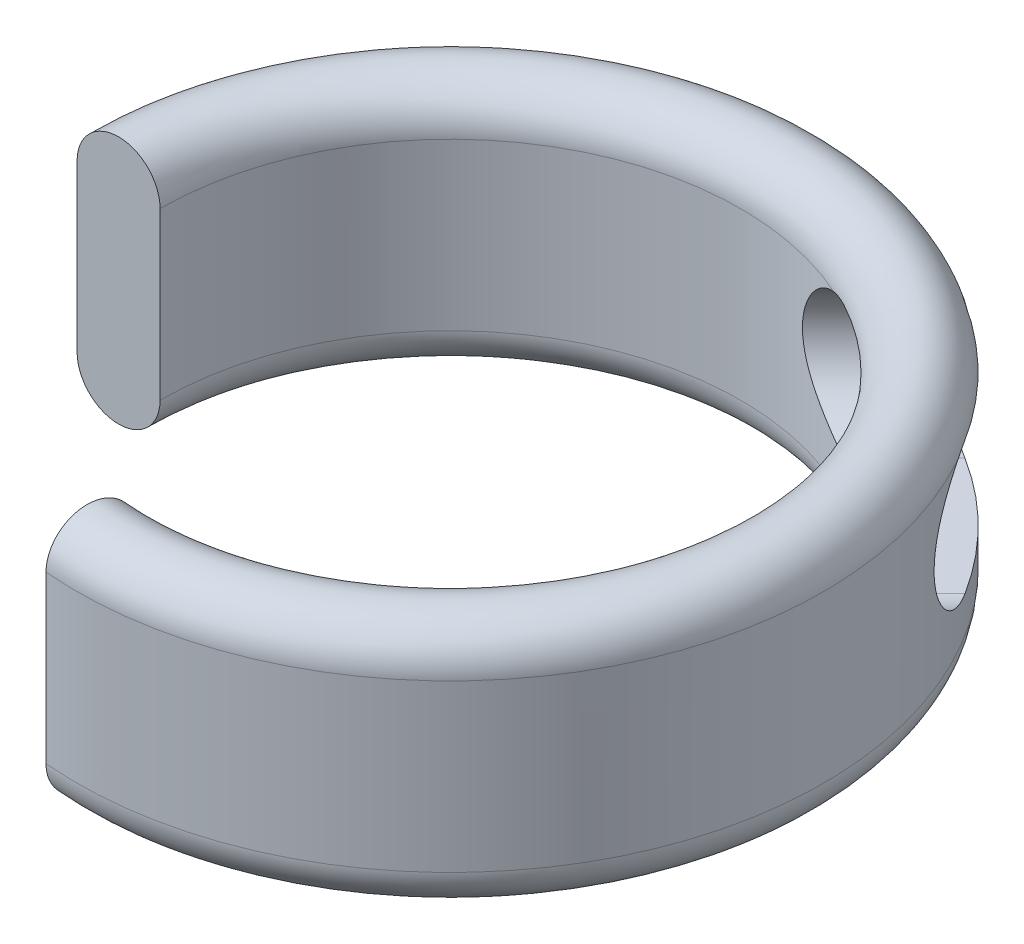
ISO-10303-21;
HEADER;
FILE_DESCRIPTION(('STEP AP214'),'2;1');
FILE_NAME('part.step','',(''),(''),'','','');
FILE_SCHEMA(('AUTOMOTIVE_DESIGN { 1 0 10303 214 1 1 1 1 }'));
ENDSEC;
DATA;
#1=APPLICATION_CONTEXT('core data for automotive mechanical design processes');
#2=APPLICATION_PROTOCOL_DEFINITION('international standard','automotive_design',2000,#1);
#3=PRODUCT_CONTEXT('',#1,'mechanical');
#4=PRODUCT('Part','Part','',(#3));
#5=PRODUCT_RELATED_PRODUCT_CATEGORY('part','',(#4));
#6=PRODUCT_DEFINITION_FORMATION('','',#4);
#7=PRODUCT_DEFINITION_CONTEXT('part definition',#1,'design');
#8=PRODUCT_DEFINITION('design','',#6,#7);
#9=PRODUCT_DEFINITION_SHAPE('','',#8);
#10=(LENGTH_UNIT() NAMED_UNIT(*) SI_UNIT(.MILLI.,.METRE.));
#11=(NAMED_UNIT(*) PLANE_ANGLE_UNIT() SI_UNIT($,.RADIAN.));
#12=(NAMED_UNIT(*) SI_UNIT($,.STERADIAN.) SOLID_ANGLE_UNIT());
#13=UNCERTAINTY_MEASURE_WITH_UNIT(LENGTH_MEASURE(1.E-05),#10,'distance_accuracy_value','');
#14=(GEOMETRIC_REPRESENTATION_CONTEXT(3) GLOBAL_UNCERTAINTY_ASSIGNED_CONTEXT((#13)) GLOBAL_UNIT_ASSIGNED_CONTEXT((#10,
#11,#12)) REPRESENTATION_CONTEXT('',''));
#15=CARTESIAN_POINT('',(0.,0.,0.));
#16=DIRECTION('',(0.,0.,1.));
#17=DIRECTION('',(1.,0.,0.));
#18=AXIS2_PLACEMENT_3D('',#15,#16,#17);
#19=CARTESIAN_POINT('',(0.,-5.,0.));
#20=DIRECTION('',(0.,1.,0.));
#21=DIRECTION('',(0.,0.,1.));
#22=AXIS2_PLACEMENT_3D('',#19,#20,#21);
#23=TOROIDAL_SURFACE('',#22,20.,2.5);
#24=CARTESIAN_POINT('',(0.,-5.,0.));
#25=DIRECTION('',(0.,1.,0.));
#26=DIRECTION('',(0.,0.,1.));
#27=AXIS2_PLACEMENT_3D('',#24,#25,#26);
#28=CIRCLE('',#27,22.5);
#29=CARTESIAN_POINT('',(-1.96100421182254,-5.,22.4143807070643));
#30=VERTEX_POINT('',#29);
#31=CARTESIAN_POINT('',(-22.5,-5.,0.));
#32=VERTEX_POINT('',#31);
#33=EDGE_CURVE('E11',#30,#32,#28,.T.);
#34=ORIENTED_EDGE('',*,*,#33,.F.);
#35=CARTESIAN_POINT('',(-1.74311485495337,-5.,19.9238939618349));
#36=DIRECTION('',(0.996194698091745,0.,0.0871557427476685));
#37=DIRECTION('',(-0.0871557427476685,0.,0.996194698091745));
#38=AXIS2_PLACEMENT_3D('',#35,#36,#37);
#39=CIRCLE('',#38,2.5);
#40=CARTESIAN_POINT('',(-1.5252254980842,-5.,17.4334072166055));
#41=VERTEX_POINT('',#40);
#42=EDGE_CURVE('E215',#30,#41,#39,.T.);
#43=ORIENTED_EDGE('',*,*,#42,.T.);
#44=CARTESIAN_POINT('',(0.,-5.,0.));
#45=DIRECTION('',(0.,1.,0.));
#46=DIRECTION('',(0.,0.,1.));
#47=AXIS2_PLACEMENT_3D('',#44,#45,#46);
#48=CIRCLE('',#47,17.5);
#49=CARTESIAN_POINT('',(-17.5,-5.,0.));
#50=VERTEX_POINT('',#49);
#51=EDGE_CURVE('E138',#41,#50,#48,.T.);
#52=ORIENTED_EDGE('',*,*,#51,.T.);
#53=CARTESIAN_POINT('',(-20.,-5.,0.));
#54=DIRECTION('',(0.,0.,1.));
#55=DIRECTION('',(-1.,0.,0.));
#56=AXIS2_PLACEMENT_3D('',#53,#54,#55);
#57=CIRCLE('',#56,2.5);
#58=EDGE_CURVE('E203',#32,#50,#57,.T.);
#59=ORIENTED_EDGE('',*,*,#58,.F.);
#60=EDGE_LOOP('',(#34,#43,#52,#59));
#61=FACE_BOUND('',#60,.T.);
#62=ADVANCED_FACE('F32',(#61),#23,.T.);
#63=CARTESIAN_POINT('',(0.,8.7572648493363,0.));
#64=DIRECTION('',(0.,1.,0.));
#65=DIRECTION('',(0.,0.,1.));
#66=AXIS2_PLACEMENT_3D('',#63,#64,#65);
#67=CYLINDRICAL_SURFACE('',#66,22.5);
#68=CARTESIAN_POINT('',(19.0476259634213,-2.8166247903554,-11.9765581515559));
#69=CARTESIAN_POINT('',(19.1112808053138,-2.81663449361547,-11.8753381699285));
#70=CARTESIAN_POINT('',(19.1741050305086,-2.81152815478291,-11.7736144214588));
#71=CARTESIAN_POINT('',(19.297682841254,-2.79127634790485,-11.5699401065588));
#72=CARTESIAN_POINT('',(19.3584369161131,-2.77613326973139,-11.4679895998807));
#73=CARTESIAN_POINT('',(19.4774145068211,-2.73602813007706,-11.264732283442));
#74=CARTESIAN_POINT('',(19.5356413610721,-2.71107948883057,-11.1634247853956));
#75=CARTESIAN_POINT('',(19.6493222130538,-2.65163687784826,-10.9620950886562));
#76=CARTESIAN_POINT('',(19.7047760861263,-2.6171424794418,-10.8620729478959));
#77=CARTESIAN_POINT('',(19.8665093303682,-2.49978108803662,-10.5651485168745));
#78=CARTESIAN_POINT('',(19.968321191861,-2.40298081208176,-10.3711120389751));
#79=CARTESIAN_POINT('',(20.1581863217661,-2.17499931889684,-9.9970836324132));
#80=CARTESIAN_POINT('',(20.2462353670804,-2.04380758163209,-9.81709602307188));
#81=CARTESIAN_POINT('',(20.4089429514052,-1.74765982415584,-9.47426176627114));
#82=CARTESIAN_POINT('',(20.4833557117861,-1.58218085057608,-9.31174817005757));
#83=CARTESIAN_POINT('',(20.6161802014917,-1.22273550761816,-9.01386635430676));
#84=CARTESIAN_POINT('',(20.6745938918045,-1.02877263396019,-8.87849480854468));
#85=CARTESIAN_POINT('',(20.7731686956879,-0.624157616190643,-8.64528875041556));
#86=CARTESIAN_POINT('',(20.8138703146728,-0.414271100391892,-8.54635939385617));
#87=CARTESIAN_POINT('',(20.8792716108319,0.0214934989329085,-8.38532440449548));
#88=CARTESIAN_POINT('',(20.9039820128574,0.247360751623616,-8.32319409400337));
#89=CARTESIAN_POINT('',(20.9358150229594,0.690037043875171,-8.24277693584569));
#90=CARTESIAN_POINT('',(20.9441373109644,0.906219372918398,-8.22150258719835));
#91=CARTESIAN_POINT('',(20.9467511887985,1.33919593798512,-8.21484313469196));
#92=CARTESIAN_POINT('',(20.9410465562612,1.55598999355592,-8.22944836798995));
#93=CARTESIAN_POINT('',(20.9162697882783,1.97376503390804,-8.29220640011654));
#94=CARTESIAN_POINT('',(20.8978122711671,2.1750181889659,-8.33881614324561));
#95=CARTESIAN_POINT('',(20.8484045490777,2.56664641368433,-8.46158210491395));
#96=CARTESIAN_POINT('',(20.8174532838341,2.75702055854643,-8.53774083106727));
#97=CARTESIAN_POINT('',(20.7422113163949,3.128108903658,-8.71897625365073));
#98=CARTESIAN_POINT('',(20.6975381777496,3.30834321461,-8.82487337537717));
#99=CARTESIAN_POINT('',(20.5955957857789,3.64879258580033,-9.06023460400831));
#100=CARTESIAN_POINT('',(20.5383198768687,3.80899699778187,-9.18971115707608));
#101=CARTESIAN_POINT('',(20.4069050133556,4.11735694782195,-9.47814045174223));
#102=CARTESIAN_POINT('',(20.3318288989547,4.26373101526314,-9.63856902279767));
#103=CARTESIAN_POINT('',(20.1683663996515,4.52666005018138,-9.97607298224266));
#104=CARTESIAN_POINT('',(20.0799894542929,4.64323600818003,-10.1531365316367));
#105=CARTESIAN_POINT('',(19.9370967454699,4.79506687011639,-10.4294465738721));
#106=CARTESIAN_POINT('',(19.8870456657814,4.84228012763503,-10.5246053991375));
#107=CARTESIAN_POINT('',(19.7840091679533,4.9278230829872,-10.717037859409));
#108=CARTESIAN_POINT('',(19.7310293052555,4.96616892987277,-10.8143072914232));
#109=CARTESIAN_POINT('',(19.6766210125622,5.,-10.9124051211452));
#110=B_SPLINE_CURVE_WITH_KNOTS('',3,(#68,#69,#70,#71,#72,#73,#74,#75,#76,#77,#78,#79,#80,#81,
#82,#83,#84,#85,#86,#87,#88,#89,#90,#91,#92,#93,#94,#95,#96,#97,#98,#99,#100,#101,#102,#103,
#104,#105,#106,#107,#108,#109),.UNSPECIFIED.,.F.,.F.,(4,2,2,2,2,2,2,2,2,2,2,2,2,2,2,2,2,2,2,2,
4),(0.,0.358577940603546,0.717070530014299,1.07507417307113,1.43309389558167,2.1481723915515,
2.86346987927385,3.59060768548323,4.31765632731182,5.02062228439924,5.7231162924089,
6.37192927553386,7.02056754395255,7.63994565352756,8.25937633686054,8.89793661002136,
9.53683492284234,10.2232360246076,10.9091522676969,11.2610955173085,11.6123926804328),.UNSPECIFIED.);
#111=CARTESIAN_POINT('',(19.0476259634213,-2.8166247903554,-11.9765581515559));
#112=VERTEX_POINT('',#111);
#113=CARTESIAN_POINT('',(19.6766210125622,5.,-10.9124051211452));
#114=VERTEX_POINT('',#113);
#115=EDGE_CURVE('E153',#112,#114,#110,.T.);
#116=ORIENTED_EDGE('',*,*,#115,.T.);
#117=CARTESIAN_POINT('',(0.,5.,0.));
#118=DIRECTION('',(0.,1.,0.));
#119=DIRECTION('',(0.,0.,1.));
#120=AXIS2_PLACEMENT_3D('',#117,#118,#119);
#121=CIRCLE('',#120,22.5);
#122=CARTESIAN_POINT('',(-1.96100421182254,5.,22.4143807070643));
#123=VERTEX_POINT('',#122);
#124=EDGE_CURVE('E40',#123,#114,#121,.T.);
#125=ORIENTED_EDGE('',*,*,#124,.F.);
#126=DIRECTION('',(0.,-1.,0.));
#127=VECTOR('',#126,1.);
#128=CARTESIAN_POINT('',(-1.96100421182254,-5.,22.4143807070643));
#129=LINE('',#128,#127);
#130=EDGE_CURVE('E150',#123,#30,#129,.T.);
#131=ORIENTED_EDGE('',*,*,#130,.T.);
#132=ORIENTED_EDGE('',*,*,#33,.T.);
#133=DIRECTION('',(0.,-1.,0.));
#134=VECTOR('',#133,1.);
#135=CARTESIAN_POINT('',(-22.5,-5.,0.));
#136=LINE('',#135,#134);
#137=CARTESIAN_POINT('',(-22.5,5.,0.));
#138=VERTEX_POINT('',#137);
#139=EDGE_CURVE('E212',#138,#32,#136,.T.);
#140=ORIENTED_EDGE('',*,*,#139,.F.);
#141=CARTESIAN_POINT('',(10.9124051211451,5.,-19.6766210125622));
#142=VERTEX_POINT('',#141);
#143=EDGE_CURVE('E135',#142,#138,#121,.T.);
#144=ORIENTED_EDGE('',*,*,#143,.F.);
#145=CARTESIAN_POINT('',(10.9124051211451,5.,-19.6766210125622));
#146=CARTESIAN_POINT('',(10.8112788281494,4.96512293138315,-19.7327091287715));
#147=CARTESIAN_POINT('',(10.7110368970832,4.92545176740616,-19.7872768739975));
#148=CARTESIAN_POINT('',(10.5130067197237,4.83679949846682,-19.8931965676737));
#149=CARTESIAN_POINT('',(10.4152183651133,4.78781880530992,-19.9445486582343));
#150=CARTESIAN_POINT('',(10.1265306489725,4.62731502369787,-20.0935349252607));
#151=CARTESIAN_POINT('',(9.94032676599695,4.50223650081431,-20.1860891135028));
#152=CARTESIAN_POINT('',(9.58702931231416,4.21918863447551,-20.3562636147612));
#153=CARTESIAN_POINT('',(9.41994584658621,4.06120202261671,-20.4338760458331));
#154=CARTESIAN_POINT('',(9.11130123835496,3.71604725212527,-20.5733535789451));
#155=CARTESIAN_POINT('',(8.96972744060927,3.52889364953636,-20.6352264956028));
#156=CARTESIAN_POINT('',(8.72131813638106,3.13450187876605,-20.7414204468196));
#157=CARTESIAN_POINT('',(8.61377116209005,2.92781189625576,-20.7861058710407));
#158=CARTESIAN_POINT('',(8.43485117880354,2.49664771282691,-20.8593557806688));
#159=CARTESIAN_POINT('',(8.36346053602341,2.27218224307078,-20.8879281253501));
#160=CARTESIAN_POINT('',(8.26503848791453,1.82992343093873,-20.9270576474749));
#161=CARTESIAN_POINT('',(8.23509478891029,1.61288184834657,-20.9387999078415));
#162=CARTESIAN_POINT('',(8.21166598011529,1.17657518141999,-20.9480006405783));
#163=CARTESIAN_POINT('',(8.21816699750388,0.95731097485699,-20.9454645480564));
#164=CARTESIAN_POINT('',(8.26590462313557,0.534956068188104,-20.9266668880979));
#165=CARTESIAN_POINT('',(8.3053006401598,0.331620423230983,-20.9111325245937));
#166=CARTESIAN_POINT('',(8.41438361679444,-0.0653126174180232,-20.8674763372946));
#167=CARTESIAN_POINT('',(8.48407359011812,-0.258909042091143,-20.8393532611369));
#168=CARTESIAN_POINT('',(8.65242381674988,-0.63591395894377,-20.7700261943319));
#169=CARTESIAN_POINT('',(8.75170508329119,-0.818991942490817,-20.7285400793718));
#170=CARTESIAN_POINT('',(8.9744848564938,-1.16613576259315,-20.6330627694758));
#171=CARTESIAN_POINT('',(9.09798988419134,-1.33019646073264,-20.5790682065553));
#172=CARTESIAN_POINT('',(9.37454574032848,-1.64721752299958,-20.4546439317997));
#173=CARTESIAN_POINT('',(9.529084617285,-1.79852521330336,-20.3833100597849));
#174=CARTESIAN_POINT('',(9.85584214033346,-2.07262606372593,-20.2273365072675));
#175=CARTESIAN_POINT('',(10.0280709970524,-2.19540262083193,-20.1426891270853));
#176=CARTESIAN_POINT('',(10.395533694243,-2.41605322380842,-19.955646341974));
#177=CARTESIAN_POINT('',(10.5915253449574,-2.51202997684149,-19.8524983312321));
#178=CARTESIAN_POINT('',(10.9912606509598,-2.66610397759726,-19.63399745109));
#179=CARTESIAN_POINT('',(11.1949943924244,-2.72424804824495,-19.5186598742858));
#180=CARTESIAN_POINT('',(11.4957286423853,-2.7804152242195,-19.3419443848111));
#181=CARTESIAN_POINT('',(11.5922193582356,-2.79397174795233,-19.28427210612));
#182=CARTESIAN_POINT('',(11.7847946998896,-2.81206865563484,-19.1671935838323));
#183=CARTESIAN_POINT('',(11.880879716478,-2.81662243819806,-19.1077900507484));
#184=CARTESIAN_POINT('',(11.9765581515558,-2.8166247903554,-19.0476259634213));
#185=B_SPLINE_CURVE_WITH_KNOTS('',3,(#145,#146,#147,#148,#149,#150,#151,#152,#153,#154,#155,
#156,#157,#158,#159,#160,#161,#162,#163,#164,#165,#166,#167,#168,#169,#170,#171,#172,#173,#174,
#175,#176,#177,#178,#179,#180,#181,#182,#183,#184),.UNSPECIFIED.,.F.,.F.,(4,2,2,2,2,2,2,2,2,2,2,
2,2,2,2,2,2,2,2,4),(0.,0.362123295781596,0.724230576827122,1.44850920142525,2.17316885048552,
2.89746800306819,3.60543140045362,4.31304918409477,4.96787039060632,5.6224423538509,
6.24266676737018,6.8629528963829,7.49730265855499,8.13182342263911,8.81208373100889,
9.49273891484585,10.2135641496263,10.9334955627957,11.2728572298151,11.6117134497699),.UNSPECIFIED.);
#186=CARTESIAN_POINT('',(11.9765581515558,-2.8166247903554,-19.0476259634213));
#187=VERTEX_POINT('',#186);
#188=EDGE_CURVE('E47',#142,#187,#185,.T.);
#189=ORIENTED_EDGE('',*,*,#188,.T.);
#190=CARTESIAN_POINT('',(0.,-2.8166247903554,0.));
#191=DIRECTION('',(0.,-1.,0.));
#192=DIRECTION('',(1.,0.,0.));
#193=AXIS2_PLACEMENT_3D('',#190,#191,#192);
#194=CIRCLE('',#193,22.5);
#195=EDGE_CURVE('E154',#187,#112,#194,.T.);
#196=ORIENTED_EDGE('',*,*,#195,.T.);
#197=EDGE_LOOP('',(#116,#125,#131,#132,#140,#144,#189,#196));
#198=FACE_BOUND('',#197,.T.);
#199=ADVANCED_FACE('F34',(#198),#67,.T.);
#200=CARTESIAN_POINT('',(0.,5.,0.));
#201=DIRECTION('',(0.,1.,0.));
#202=DIRECTION('',(0.,0.,1.));
#203=AXIS2_PLACEMENT_3D('',#200,#201,#202);
#204=TOROIDAL_SURFACE('',#203,20.,2.5);
#205=CARTESIAN_POINT('',(14.0971750419305,4.32686626947927,-10.5242392906768));
#206=CARTESIAN_POINT('',(14.1331057788877,4.39009652917659,-10.4466072124374));
#207=CARTESIAN_POINT('',(14.1728266712285,4.45059223396145,-10.3685704791871));
#208=CARTESIAN_POINT('',(14.2582509340677,4.56541151959514,-10.2112267848131));
#209=CARTESIAN_POINT('',(14.3039544864483,4.61973491270219,-10.1319197851355));
#210=CARTESIAN_POINT('',(14.3993861205135,4.72112256629241,-9.97217811578787));
#211=CARTESIAN_POINT('',(14.449081592279,4.76823801625167,-9.89175629343904));
#212=CARTESIAN_POINT('',(14.551334113064,4.85522729995215,-9.72889481913704));
#213=CARTESIAN_POINT('',(14.6038896361736,4.89510494695214,-9.64645625584287));
#214=CARTESIAN_POINT('',(14.6754037786039,4.9435152588394,-9.53440891511039));
#215=CARTESIAN_POINT('',(14.6936835494451,4.95538893193222,-9.50577952238145));
#216=CARTESIAN_POINT('',(14.7303899977634,4.97825793674164,-9.44823632095207));
#217=CARTESIAN_POINT('',(14.7488167626367,4.98925269520338,-9.4193223402197));
#218=CARTESIAN_POINT('',(14.8215253738358,5.03076830465706,-9.30497045382116));
#219=CARTESIAN_POINT('',(14.8761526027714,5.05787916257421,-9.21848205659756));
#220=CARTESIAN_POINT('',(14.9851118902348,5.10423655943572,-9.04319663693111));
#221=CARTESIAN_POINT('',(15.0394437953128,5.12347933583578,-8.95439853151503));
#222=CARTESIAN_POINT('',(15.147005640156,5.15407943795099,-8.7746177447856));
#223=CARTESIAN_POINT('',(15.2002338960603,5.16542546740289,-8.68363212580035));
#224=CARTESIAN_POINT('',(15.3048553818118,5.18025005401801,-8.4999971214335));
#225=CARTESIAN_POINT('',(15.3562488104203,5.18372946590868,-8.40734791790714));
#226=CARTESIAN_POINT('',(15.4567148454322,5.18296472370492,-8.2210607110377));
#227=CARTESIAN_POINT('',(15.5057916380776,5.17873509479992,-8.12742489707798));
#228=CARTESIAN_POINT('',(15.601577588555,5.16276315613704,-7.9395915580114));
#229=CARTESIAN_POINT('',(15.6482867563386,5.15102087795927,-7.84539403526739));
#230=CARTESIAN_POINT('',(15.7394240235398,5.12021033466768,-7.65708996546802));
#231=CARTESIAN_POINT('',(15.7838519509125,5.10114151792369,-7.56298342579796));
#232=CARTESIAN_POINT('',(15.8707249043311,5.05582991330136,-7.37556713721294));
#233=CARTESIAN_POINT('',(15.9131695119113,5.02958561938226,-7.28225755981473));
#234=CARTESIAN_POINT('',(16.0004550658975,4.96722614057335,-7.08856943636553));
#235=CARTESIAN_POINT('',(16.0451483970807,4.93041691455384,-6.98834682318716));
#236=CARTESIAN_POINT('',(16.1335895163999,4.84835582160764,-6.79104389722723));
#237=CARTESIAN_POINT('',(16.1773376917263,4.80310748791991,-6.69396228927542));
#238=CARTESIAN_POINT('',(16.2651017201548,4.7039846564173,-6.5042791613161));
#239=CARTESIAN_POINT('',(16.3091177248806,4.65010472794785,-6.41168050988523));
#240=CARTESIAN_POINT('',(16.3764485287766,4.56265822837846,-6.27765724414827));
#241=CARTESIAN_POINT('',(16.3991309193151,4.53237473378887,-6.23375799222516));
#242=CARTESIAN_POINT('',(16.4451655797821,4.46956731017568,-6.14792313808266));
#243=CARTESIAN_POINT('',(16.4685181726049,4.43704229027069,-6.10598850890008));
#244=CARTESIAN_POINT('',(16.4923180423794,4.40339074838943,-6.06521091899154));
#245=B_SPLINE_CURVE_WITH_KNOTS('',3,(#205,#206,#207,#208,#209,#210,#211,#212,#213,#214,#215,
#216,#217,#218,#219,#220,#221,#222,#223,#224,#225,#226,#227,#228,#229,#230,#231,#232,#233,#234,
#235,#236,#237,#238,#239,#240,#241,#242,#243,#244),.UNSPECIFIED.,.F.,.F.,(4,2,2,2,2,2,2,2,2,2,2,
2,2,2,2,2,2,2,2,4),(0.,0.318958620899355,0.637926940893851,0.954512812438763,1.27093140248755,
1.37887145959918,1.48688135363292,1.80401292126192,2.12129596545794,2.4390319539881,
2.756733418058,3.07383689536843,3.390939039714,3.70806506401255,4.02525770016648,
4.3721428264634,4.71888304551184,5.06584228266527,5.23963479329013,5.41351248894118),.UNSPECIFIED.);
#246=CARTESIAN_POINT('',(15.3990440965516,5.1833752096446,-8.32797628468616));
#247=VERTEX_POINT('',#246);
#248=CARTESIAN_POINT('',(15.95458088593,5.,-7.19036499451297));
#249=VERTEX_POINT('',#248);
#250=EDGE_CURVE('E112',#247,#249,#245,.T.);
#251=ORIENTED_EDGE('',*,*,#250,.T.);
#252=CARTESIAN_POINT('',(0.,5.,0.));
#253=DIRECTION('',(0.,1.,0.));
#254=DIRECTION('',(0.,0.,1.));
#255=AXIS2_PLACEMENT_3D('',#252,#253,#254);
#256=CIRCLE('',#255,17.5);
#257=CARTESIAN_POINT('',(-1.5252254980842,5.,17.4334072166055));
#258=VERTEX_POINT('',#257);
#259=EDGE_CURVE('E125',#258,#249,#256,.T.);
#260=ORIENTED_EDGE('',*,*,#259,.F.);
#261=CARTESIAN_POINT('',(-1.74311485495337,5.,19.9238939618349));
#262=DIRECTION('',(0.996194698091745,0.,0.0871557427476685));
#263=DIRECTION('',(-0.0871557427476685,0.,0.996194698091745));
#264=AXIS2_PLACEMENT_3D('',#261,#262,#263);
#265=CIRCLE('',#264,2.5);
#266=EDGE_CURVE('E145',#258,#123,#265,.T.);
#267=ORIENTED_EDGE('',*,*,#266,.T.);
#268=ORIENTED_EDGE('',*,*,#124,.T.);
#269=CARTESIAN_POINT('',(20.2563478251141,4.22117769753834,-9.50512891728897));
#270=CARTESIAN_POINT('',(20.2390025198282,4.28305531880653,-9.58986197885434));
#271=CARTESIAN_POINT('',(20.2173680458712,4.34319087994632,-9.67494802316869));
#272=CARTESIAN_POINT('',(20.166485809232,4.45897862197032,-9.84585043720391));
#273=CARTESIAN_POINT('',(20.1372407028967,4.51463235829325,-9.93166654202195));
#274=CARTESIAN_POINT('',(20.0723055829592,4.62014946718448,-10.1035387087298));
#275=CARTESIAN_POINT('',(20.0366597482353,4.67004890444149,-10.1895893744531));
#276=CARTESIAN_POINT('',(19.959818152285,4.76373933815505,-10.3624936851841));
#277=CARTESIAN_POINT('',(19.9186232380657,4.80753126478476,-10.4493472057638));
#278=CARTESIAN_POINT('',(19.8132450999627,4.90556686318627,-10.6608802996851));
#279=CARTESIAN_POINT('',(19.746713563306,4.95638527429705,-10.7860053276327));
#280=CARTESIAN_POINT('',(19.6278804109133,5.03032873218884,-11.0003004057538));
#281=CARTESIAN_POINT('',(19.5772164263426,5.05719653482364,-11.0891191556742));
#282=CARTESIAN_POINT('',(19.4734701024947,5.10336202297248,-11.2673523238788));
#283=CARTESIAN_POINT('',(19.4203872413479,5.12265806617542,-11.3567668671179));
#284=CARTESIAN_POINT('',(19.3124350258945,5.15349445906652,-11.5360632626294));
#285=CARTESIAN_POINT('',(19.2575627728458,5.1650214946838,-11.6259456524483));
#286=CARTESIAN_POINT('',(19.1466812378366,5.18014614594211,-11.8056705400406));
#287=CARTESIAN_POINT('',(19.0906720329338,5.18374429716985,-11.8955130400985));
#288=CARTESIAN_POINT('',(18.9798584187988,5.18296003214772,-12.0716108116361));
#289=CARTESIAN_POINT('',(18.9250789459679,5.17884818799638,-12.1578830674994));
#290=CARTESIAN_POINT('',(18.8150474492797,5.16314779787289,-12.3294424585933));
#291=CARTESIAN_POINT('',(18.759795429957,5.15155932356915,-12.4147296032588));
#292=CARTESIAN_POINT('',(18.6489886317328,5.12093078992405,-12.5835538497398));
#293=CARTESIAN_POINT('',(18.5934344967142,5.10190296302281,-12.6670935884424));
#294=CARTESIAN_POINT('',(18.4818895257207,5.05641475068211,-12.8318224251488));
#295=CARTESIAN_POINT('',(18.4258987305076,5.02995505111466,-12.913011739306));
#296=CARTESIAN_POINT('',(18.3171957165074,4.97172073874152,-13.0666932224333));
#297=CARTESIAN_POINT('',(18.2645231255317,4.94043737072812,-13.1393993580341));
#298=CARTESIAN_POINT('',(18.158476605996,4.87153932662205,-13.2811762538502));
#299=CARTESIAN_POINT('',(18.1051029388684,4.83392695211102,-13.3502483236722));
#300=CARTESIAN_POINT('',(17.9971646225121,4.75230616186721,-13.4841157937122));
#301=CARTESIAN_POINT('',(17.9425959904492,4.7082721787136,-13.5488925176422));
#302=CARTESIAN_POINT('',(17.8321201602151,4.61411916948459,-13.6727951586979));
#303=CARTESIAN_POINT('',(17.7762113947411,4.56399270843447,-13.7319140108123));
#304=CARTESIAN_POINT('',(17.7195191823831,4.51097241896771,-13.7875903647341));
#305=B_SPLINE_CURVE_WITH_KNOTS('',3,(#269,#270,#271,#272,#273,#274,#275,#276,#277,#278,#279,
#280,#281,#282,#283,#284,#285,#286,#287,#288,#289,#290,#291,#292,#293,#294,#295,#296,#297,#298,
#299,#300,#301,#302,#303,#304),.UNSPECIFIED.,.F.,.F.,(4,2,2,2,2,2,2,2,2,2,2,2,2,2,2,2,2,4),(0.,
0.318890796341504,0.637670438829238,0.954328939421865,1.27093916017368,1.72160283459845,
2.03850430987591,2.35547448299227,2.6729864891535,2.99047704709866,3.29703367485724,
3.60358736411291,3.90963909641643,4.21566259311953,4.50062028336794,4.78547457009288,
5.07149563246526,5.35786931387774),.UNSPECIFIED.);
#306=CARTESIAN_POINT('',(19.0427418909173,5.1833752096446,-11.9716740790519));
#307=VERTEX_POINT('',#306);
#308=EDGE_CURVE('E144',#114,#307,#305,.T.);
#309=ORIENTED_EDGE('',*,*,#308,.T.);
#310=CARTESIAN_POINT('',(0.,5.1833752096446,0.));
#311=DIRECTION('',(0.,1.,0.));
#312=DIRECTION('',(-1.,0.,0.));
#313=AXIS2_PLACEMENT_3D('',#310,#311,#312);
#314=CIRCLE('',#313,22.4932656361663);
#315=CARTESIAN_POINT('',(11.971674079038,5.18337520964461,-19.042741890926));
#316=VERTEX_POINT('',#315);
#317=EDGE_CURVE('E129',#307,#316,#314,.T.);
#318=ORIENTED_EDGE('',*,*,#317,.T.);
#319=CARTESIAN_POINT('',(13.7875903647341,4.5109724189677,-17.7195191823831));
#320=CARTESIAN_POINT('',(13.731929035202,4.56397837149835,-17.7761961197319));
#321=CARTESIAN_POINT('',(13.6728271173376,4.6140920576951,-17.8320899537249));
#322=CARTESIAN_POINT('',(13.5489625354627,4.70822179011245,-17.9425352790952));
#323=CARTESIAN_POINT('',(13.4842070647278,4.75224540577967,-17.9970883662406));
#324=CARTESIAN_POINT('',(13.3503462944726,4.83387230222914,-18.1050265888284));
#325=CARTESIAN_POINT('',(13.2812570976546,4.87149762308068,-18.158415157725));
#326=CARTESIAN_POINT('',(13.1394424834229,4.94041882864358,-18.2644918472728));
#327=CARTESIAN_POINT('',(13.0667156660548,4.97171225275421,-18.317179688216));
#328=CARTESIAN_POINT('',(12.9100429835041,5.03107997700404,-18.4279987814514));
#329=CARTESIAN_POINT('',(12.8257614473981,5.0583842066739,-18.4860681309749));
#330=CARTESIAN_POINT('',(12.6547008677452,5.10499550615141,-18.6017431661062));
#331=CARTESIAN_POINT('',(12.5679215146173,5.12430158005835,-18.659348793098));
#332=CARTESIAN_POINT('',(12.3925938623975,5.15491042729634,-18.7741996768899));
#333=CARTESIAN_POINT('',(12.3040437394373,5.16620446010223,-18.8314444728083));
#334=CARTESIAN_POINT('',(12.1259553098343,5.18075665354011,-18.945407515929));
#335=CARTESIAN_POINT('',(12.0364170328718,5.18401505487378,-19.0021257788526));
#336=CARTESIAN_POINT('',(11.8602929687204,5.18255611851131,-19.1126541547783));
#337=CARTESIAN_POINT('',(11.7737228296973,5.17813421762954,-19.1664934008644));
#338=CARTESIAN_POINT('',(11.6005686739446,5.16194068588706,-19.2730769109577));
#339=CARTESIAN_POINT('',(11.5139846584413,5.150167411502,-19.3258209273824));
#340=CARTESIAN_POINT('',(11.3411486188597,5.11938741939205,-19.4296757362772));
#341=CARTESIAN_POINT('',(11.2548965294531,5.10038220722074,-19.4807868662844));
#342=CARTESIAN_POINT('',(11.0829259485226,5.05531758221489,-19.5807473855577));
#343=CARTESIAN_POINT('',(10.9972074596327,5.02925813458596,-19.6295967636665));
#344=CARTESIAN_POINT('',(10.8231331557236,4.9691998877741,-19.7261237838504));
#345=CARTESIAN_POINT('',(10.7348039205901,4.9349324731763,-19.7736825908212));
#346=CARTESIAN_POINT('',(10.5589844849672,4.85947311872006,-19.8646071147107));
#347=CARTESIAN_POINT('',(10.4714940390529,4.81828327401067,-19.9079740940949));
#348=CARTESIAN_POINT('',(10.2974501731076,4.72955292641073,-19.9894886028581));
#349=CARTESIAN_POINT('',(10.2108957978207,4.68201972334619,-20.0276420312511));
#350=CARTESIAN_POINT('',(10.0386391043674,4.58126397100253,-20.0977583088076));
#351=CARTESIAN_POINT('',(9.95293640838236,4.52804407997865,-20.1297240309509));
#352=CARTESIAN_POINT('',(9.80680835676799,4.43273154486931,-20.1783437523618));
#353=CARTESIAN_POINT('',(9.74618686608838,4.39182841366842,-20.1967593310151));
#354=CARTESIAN_POINT('',(9.62536296106838,4.30796173448388,-20.229611238033));
#355=CARTESIAN_POINT('',(9.56516027021882,4.26499973096132,-20.2440504960281));
#356=CARTESIAN_POINT('',(9.5051289172889,4.22117769753836,-20.2563478251141));
#357=B_SPLINE_CURVE_WITH_KNOTS('',3,(#319,#320,#321,#322,#323,#324,#325,#326,#327,#328,#329,
#330,#331,#332,#333,#334,#335,#336,#337,#338,#339,#340,#341,#342,#343,#344,#345,#346,#347,#348,
#349,#350,#351,#352,#353,#354,#355,#356),.UNSPECIFIED.,.F.,.F.,(4,2,2,2,2,2,2,2,2,2,2,2,2,2,2,2,
2,2,4),(0.,0.286296305765072,0.572233509159643,0.857164870557666,1.14220674567783,
1.45964421123614,1.77712119105974,2.09494398363092,2.41275725592872,2.71861435134007,
3.02453985079282,3.33040169711585,3.63626505210211,3.95398554323027,4.27161004539106,
4.5888721330304,4.90598655926057,5.13209953830559,5.35804547582767),.UNSPECIFIED.);
#358=EDGE_CURVE('E197',#316,#142,#357,.T.);
#359=ORIENTED_EDGE('',*,*,#358,.T.);
#360=ORIENTED_EDGE('',*,*,#143,.T.);
#361=CARTESIAN_POINT('',(-20.,5.,0.));
#362=DIRECTION('',(0.,0.,1.));
#363=DIRECTION('',(-1.,0.,0.));
#364=AXIS2_PLACEMENT_3D('',#361,#362,#363);
#365=CIRCLE('',#364,2.5);
#366=CARTESIAN_POINT('',(-17.5,5.,0.));
#367=VERTEX_POINT('',#366);
#368=EDGE_CURVE('E209',#367,#138,#365,.T.);
#369=ORIENTED_EDGE('',*,*,#368,.F.);
#370=CARTESIAN_POINT('',(7.19036499451291,5.,-15.95458088593));
#371=VERTEX_POINT('',#370);
#372=EDGE_CURVE('E136',#371,#367,#256,.T.);
#373=ORIENTED_EDGE('',*,*,#372,.F.);
#374=CARTESIAN_POINT('',(6.06521091899088,4.40339074838995,-16.4923180423784));
#375=CARTESIAN_POINT('',(6.10263284531248,4.43427426994805,-16.4704748102742));
#376=CARTESIAN_POINT('',(6.14103214583329,4.46420967580086,-16.4490091693692));
#377=CARTESIAN_POINT('',(6.21951270447988,4.52219210562128,-16.4066573496293));
#378=CARTESIAN_POINT('',(6.25959329509109,4.55023986772521,-16.3857709461924));
#379=CARTESIAN_POINT('',(6.3819080731975,4.63154191454688,-16.3237353764539));
#380=CARTESIAN_POINT('',(6.46629474794984,4.68201957434801,-16.2831648612973));
#381=CARTESIAN_POINT('',(6.63837165015772,4.77526707409868,-16.2027776845626));
#382=CARTESIAN_POINT('',(6.72602554162306,4.81810186923123,-16.1629575257398));
#383=CARTESIAN_POINT('',(6.9041783614354,4.89673506265235,-16.0827754815039));
#384=CARTESIAN_POINT('',(6.99467663042298,4.93253507793154,-16.0424137228651));
#385=CARTESIAN_POINT('',(7.12052402966324,4.97697979144207,-15.9860019857228));
#386=CARTESIAN_POINT('',(7.15507587086394,4.98863807775115,-15.9704849551706));
#387=CARTESIAN_POINT('',(7.28200566189726,5.02950546220703,-15.913280330129));
#388=CARTESIAN_POINT('',(7.37508867067969,5.05569536071907,-15.8709418473912));
#389=CARTESIAN_POINT('',(7.56209798069923,5.10094618096964,-15.7842671892619));
#390=CARTESIAN_POINT('',(7.65602466165768,5.12000370902571,-15.7399300741058));
#391=CARTESIAN_POINT('',(7.84414085128443,5.15084777306757,-15.6489027158758));
#392=CARTESIAN_POINT('',(7.9383305364765,5.16262205001503,-15.6022086476939));
#393=CARTESIAN_POINT('',(8.12613300161497,5.17865865442367,-15.5064622765402));
#394=CARTESIAN_POINT('',(8.219745880425,5.18292230701906,-15.4574103911383));
#395=CARTESIAN_POINT('',(8.40615553930204,5.18376119139105,-15.3569052722774));
#396=CARTESIAN_POINT('',(8.49894808535469,5.18030826196146,-15.3054439163643));
#397=CARTESIAN_POINT('',(8.68287148474293,5.16551309112787,-15.2006762900598));
#398=CARTESIAN_POINT('',(8.77400206208852,5.15416955141679,-15.1473697174315));
#399=CARTESIAN_POINT('',(8.95400949413185,5.12356012855432,-15.0396808076295));
#400=CARTESIAN_POINT('',(9.04289059356818,5.10431056602731,-14.9853009050167));
#401=CARTESIAN_POINT('',(9.21833533247597,5.05792487310051,-14.8762450274842));
#402=CARTESIAN_POINT('',(9.3049001806909,5.03079294739648,-14.8215692256267));
#403=CARTESIAN_POINT('',(9.41684341644003,4.99015294269401,-14.7503932005813));
#404=CARTESIAN_POINT('',(9.44330058477569,4.98013180391462,-14.7335358644515));
#405=CARTESIAN_POINT('',(9.56170523913123,4.93342046912135,-14.6580161810719));
#406=CARTESIAN_POINT('',(9.65242820029208,4.89254697623545,-14.5999408185004));
#407=CARTESIAN_POINT('',(9.83138716547748,4.80205944001965,-14.4867312616616));
#408=CARTESIAN_POINT('',(9.91962130451796,4.75243903402817,-14.4315992467345));
#409=CARTESIAN_POINT('',(10.0948189257812,4.6445008802694,-14.3256365460498));
#410=CARTESIAN_POINT('',(10.1817624415985,4.5861051649801,-14.2748515751745));
#411=CARTESIAN_POINT('',(10.3109576737563,4.49290399462273,-14.2039078622258));
#412=CARTESIAN_POINT('',(10.3538203967642,4.46090152612375,-14.1811317781));
#413=CARTESIAN_POINT('',(10.4392385959394,4.39515555872063,-14.1375835628744));
#414=CARTESIAN_POINT('',(10.4817940237381,4.36141179226118,-14.1168117411508));
#415=CARTESIAN_POINT('',(10.5242392906767,4.32686626947927,-14.0971750419306));
#416=B_SPLINE_CURVE_WITH_KNOTS('',3,(#374,#375,#376,#377,#378,#379,#380,#381,#382,#383,#384,
#385,#386,#387,#388,#389,#390,#391,#392,#393,#394,#395,#396,#397,#398,#399,#400,#401,#402,#403,
#404,#405,#406,#407,#408,#409,#410,#411,#412,#413,#414,#415),.UNSPECIFIED.,.F.,.F.,(4,2,2,2,2,2,
2,2,2,2,2,2,2,2,2,2,2,2,2,2,4),(0.,0.159582696494687,0.319102623443258,0.637808152365631,
0.953660630623388,1.26944042295985,1.38832401016272,1.70471144128422,2.02124922319054,
2.33831835632237,2.65533154187476,2.97350353668707,3.29172789534492,3.60929861024784,
3.92670023320182,4.02549663376614,4.37068061255932,4.71611672839921,5.06482651549015,
5.23918954606952,5.41357944825695),.UNSPECIFIED.);
#417=CARTESIAN_POINT('',(8.3279762846861,5.18337520964461,-15.3990440965516));
#418=VERTEX_POINT('',#417);
#419=EDGE_CURVE('E192',#371,#418,#416,.T.);
#420=ORIENTED_EDGE('',*,*,#419,.T.);
#421=CARTESIAN_POINT('',(0.,5.1833752096446,0.));
#422=DIRECTION('',(0.,-1.,0.));
#423=DIRECTION('',(1.,0.,0.));
#424=AXIS2_PLACEMENT_3D('',#421,#422,#423);
#425=CIRCLE('',#424,17.5067343638337);
#426=EDGE_CURVE('E128',#418,#247,#425,.T.);
#427=ORIENTED_EDGE('',*,*,#426,.T.);
#428=EDGE_LOOP('',(#251,#260,#267,#268,#309,#318,#359,#360,#369,#373,#420,#427));
#429=FACE_BOUND('',#428,.T.);
#430=ADVANCED_FACE('F123',(#429),#204,.T.);
#431=CARTESIAN_POINT('',(0.,8.7572648493363,0.));
#432=DIRECTION('',(0.,1.,0.));
#433=DIRECTION('',(0.,0.,1.));
#434=AXIS2_PLACEMENT_3D('',#431,#432,#433);
#435=CYLINDRICAL_SURFACE('',#434,17.5);
#436=CARTESIAN_POINT('',(15.95458088593,5.,-7.19036499451297));
#437=CARTESIAN_POINT('',(16.0047932250119,4.96415606112817,-7.07897349084338));
#438=CARTESIAN_POINT('',(16.0532053530117,4.92325575484119,-6.96841466171953));
#439=CARTESIAN_POINT('',(16.1463334750126,4.83171275773334,-6.74981041569491));
#440=CARTESIAN_POINT('',(16.191049717902,4.78107072370563,-6.64176482989991));
#441=CARTESIAN_POINT('',(16.2767904330713,4.67028916556342,-6.42878818332177));
#442=CARTESIAN_POINT('',(16.3178066514741,4.61012919356536,-6.32386441950528));
#443=CARTESIAN_POINT('',(16.3960017812757,4.4807856115986,-6.11827116190113));
#444=CARTESIAN_POINT('',(16.433180622705,4.41160183714525,-6.01760174570543));
#445=CARTESIAN_POINT('',(16.5389865030748,4.19099811918973,-5.7232202583575));
#446=CARTESIAN_POINT('',(16.6019231387026,4.0264731590674,-5.53703339408333));
#447=CARTESIAN_POINT('',(16.7127685503844,3.66578203399759,-5.19289286598299));
#448=CARTESIAN_POINT('',(16.7606860360821,3.46963430749362,-5.03492286207452));
#449=CARTESIAN_POINT('',(16.8208788147716,3.15912277159127,-4.8283485310837));
#450=CARTESIAN_POINT('',(16.8387511078326,3.05509746309217,-4.76551188741006));
#451=CARTESIAN_POINT('',(16.871189223648,2.84138906771135,-4.64936585251041));
#452=CARTESIAN_POINT('',(16.8857568112805,2.73170903932676,-4.59605137922004));
#453=CARTESIAN_POINT('',(16.9116183430876,2.50755874793867,-4.49996053074975));
#454=CARTESIAN_POINT('',(16.9229149729692,2.39309250367641,-4.45717551443536));
#455=CARTESIAN_POINT('',(16.9422817350803,2.16026401162041,-4.38298579231239));
#456=CARTESIAN_POINT('',(16.9503524465238,2.04190246736276,-4.35157904362905));
#457=CARTESIAN_POINT('',(16.9624332381294,1.81829376507124,-4.30422710292468));
#458=CARTESIAN_POINT('',(16.9668392094701,1.7133826631179,-4.28678631481397));
#459=CARTESIAN_POINT('',(16.9732471275115,1.50235272837817,-4.26134444273323));
#460=CARTESIAN_POINT('',(16.9752493492243,1.39623403515446,-4.25334227889586));
#461=CARTESIAN_POINT('',(16.9768534035015,1.18373217900542,-4.24693528530368));
#462=CARTESIAN_POINT('',(16.9764561917452,1.07734913824199,-4.24852663451237));
#463=CARTESIAN_POINT('',(16.9732631454146,0.865197036514346,-4.2612651920995));
#464=CARTESIAN_POINT('',(16.9704673954016,0.759427954037164,-4.27241206359467));
#465=CARTESIAN_POINT('',(16.9628221777665,0.558589921861549,-4.30266001715202));
#466=CARTESIAN_POINT('',(16.9581738983314,0.46339475987942,-4.320979439521));
#467=CARTESIAN_POINT('',(16.946869388393,0.2748659065123,-4.36510366643083));
#468=CARTESIAN_POINT('',(16.9402124881725,0.181532847074936,-4.39091096748066));
#469=CARTESIAN_POINT('',(16.9172124879089,-0.094743202671247,-4.47902374053499));
#470=CARTESIAN_POINT('',(16.8978340320031,-0.274125336966161,-4.55204532466914));
#471=CARTESIAN_POINT('',(16.8497268313944,-0.627739692094895,-4.72707901163065));
#472=CARTESIAN_POINT('',(16.8205875941228,-0.801292354465038,-4.83033297264561));
#473=CARTESIAN_POINT('',(16.7530595825775,-1.13066278494212,-5.05957174145498));
#474=CARTESIAN_POINT('',(16.7146671007352,-1.28647340726948,-5.18556565554558));
#475=CARTESIAN_POINT('',(16.6229135055279,-1.59671377230942,-5.47304725016535));
#476=CARTESIAN_POINT('',(16.5682728950023,-1.74847293878279,-5.63700893372368));
#477=CARTESIAN_POINT('',(16.4466217332555,-2.02451202566186,-5.98266114572888));
#478=CARTESIAN_POINT('',(16.3796010066021,-2.1487691556411,-6.16436619942655));
#479=CARTESIAN_POINT('',(16.2257787929251,-2.37858095831376,-6.55921863617733));
#480=CARTESIAN_POINT('',(16.1376653269343,-2.4809944951514,-6.77368994584808));
#481=CARTESIAN_POINT('',(15.9470528494221,-2.64674942245502,-7.21097522928604));
#482=CARTESIAN_POINT('',(15.8445734236637,-2.71014338611145,-7.43377754672159));
#483=CARTESIAN_POINT('',(15.6817307077212,-2.77383044750757,-7.76844366640249));
#484=CARTESIAN_POINT('',(15.6260785308086,-2.78982438054056,-7.87979922248262));
#485=CARTESIAN_POINT('',(15.5120523694729,-2.81121462179364,-8.10196550988849));
#486=CARTESIAN_POINT('',(15.4536816347052,-2.8166232664534,-8.21277672512234));
#487=CARTESIAN_POINT('',(15.3940751315641,-2.8166247903554,-8.32300731969871));
#488=B_SPLINE_CURVE_WITH_KNOTS('',3,(#436,#437,#438,#439,#440,#441,#442,#443,#444,#445,#446,
#447,#448,#449,#450,#451,#452,#453,#454,#455,#456,#457,#458,#459,#460,#461,#462,#463,#464,#465,
#466,#467,#468,#469,#470,#471,#472,#473,#474,#475,#476,#477,#478,#479,#480,#481,#482,#483,#484,
#485,#486,#487),.UNSPECIFIED.,.F.,.F.,(4,2,2,2,2,2,2,2,2,2,2,2,2,2,2,2,2,2,2,2,2,2,2,2,2,4),(0.,
0.381865525482241,0.76370531437744,1.14637685652422,1.52905537493067,2.29405324294036,
3.05860666241796,3.42667209451262,3.79454049605651,4.16210598732988,4.52960545248668,
4.84849740009347,5.16735285992367,5.48608133000285,5.8047985636612,6.09561764527683,
6.38653379956179,6.96787892793518,7.57762075496993,8.18760729928019,8.87479562076905,
9.56255128789868,10.319528875483,11.0754843005661,11.4515997451941,11.8272765909977),.UNSPECIFIED.);
#489=CARTESIAN_POINT('',(15.3940751315641,-2.8166247903554,-8.32300731969872));
#490=VERTEX_POINT('',#489);
#491=EDGE_CURVE('E108',#249,#490,#488,.T.);
#492=ORIENTED_EDGE('',*,*,#491,.T.);
#493=CARTESIAN_POINT('',(0.,-2.8166247903554,0.));
#494=DIRECTION('',(0.,-1.,0.));
#495=DIRECTION('',(1.,0.,0.));
#496=AXIS2_PLACEMENT_3D('',#493,#494,#495);
#497=CIRCLE('',#496,17.5);
#498=CARTESIAN_POINT('',(8.32300731969866,-2.8166247903554,-15.3940751315642));
#499=VERTEX_POINT('',#498);
#500=EDGE_CURVE('E234',#490,#499,#497,.F.);
#501=ORIENTED_EDGE('',*,*,#500,.T.);
#502=CARTESIAN_POINT('',(8.32300731969866,-2.8166247903554,-15.3940751315642));
#503=CARTESIAN_POINT('',(8.21345363372057,-2.81663345746891,-15.4533211691964));
#504=CARTESIAN_POINT('',(8.10327724104364,-2.81128280649768,-15.5113639072343));
#505=CARTESIAN_POINT('',(7.88255243007227,-2.79014651971075,-15.6246803151385));
#506=CARTESIAN_POINT('',(7.77200417043464,-2.77436488149276,-15.6799550370996));
#507=CARTESIAN_POINT('',(7.55154976521618,-2.73269255907616,-15.7873088215363));
#508=CARTESIAN_POINT('',(7.44164276830879,-2.70682264170821,-15.8393941960989));
#509=CARTESIAN_POINT('',(7.22307707604152,-2.64531636212604,-15.9402532514736));
#510=CARTESIAN_POINT('',(7.11441849079111,-2.60967914522555,-15.9890266420046));
#511=CARTESIAN_POINT('',(6.79176032057312,-2.4886952180344,-16.1299968805062));
#512=CARTESIAN_POINT('',(6.58062598926379,-2.38918936083711,-16.2170624901662));
#513=CARTESIAN_POINT('',(6.17269851532204,-2.15526352838107,-16.3766901993579));
#514=CARTESIAN_POINT('',(5.97591650036129,-2.02081682359113,-16.4492411197129));
#515=CARTESIAN_POINT('',(5.597035132117,-1.71460935079411,-16.5820595774817));
#516=CARTESIAN_POINT('',(5.41562138778692,-1.54177729085363,-16.6418509194802));
#517=CARTESIAN_POINT('',(5.16643005763002,-1.25946965532241,-16.7202173411751));
#518=CARTESIAN_POINT('',(5.08715126250883,-1.16146475519442,-16.7444627348702));
#519=CARTESIAN_POINT('',(4.93729685045939,-0.958250064439907,-16.7892582047778));
#520=CARTESIAN_POINT('',(4.86671621450095,-0.853044483796772,-16.8098104152053));
#521=CARTESIAN_POINT('',(4.73898465919434,-0.642015170716303,-16.8462517970644));
#522=CARTESIAN_POINT('',(4.68130934188151,-0.536542117024343,-16.8623349558317));
#523=CARTESIAN_POINT('',(4.57571900581125,-0.320452773386218,-16.8912933850325));
#524=CARTESIAN_POINT('',(4.52779845512484,-0.20983944245657,-16.9041704745578));
#525=CARTESIAN_POINT('',(4.44263980678411,0.0156302472667656,-16.9267508457891));
#526=CARTESIAN_POINT('',(4.40539176576852,0.130482543321056,-16.9364570829038));
#527=CARTESIAN_POINT('',(4.34232651762589,0.363498245971546,-16.9527362512493));
#528=CARTESIAN_POINT('',(4.31650733002032,0.481661075116971,-16.9593097253641));
#529=CARTESIAN_POINT('',(4.27958682545151,0.703938196248227,-16.9686606558051));
#530=CARTESIAN_POINT('',(4.2669648535703,0.807785563943977,-16.9718318941622));
#531=CARTESIAN_POINT('',(4.25094127966904,1.0162292388853,-16.9758524910038));
#532=CARTESIAN_POINT('',(4.24753877696996,1.12082547197078,-16.976702076298));
#533=CARTESIAN_POINT('',(4.25002270614272,1.3298766589992,-16.976080561349));
#534=CARTESIAN_POINT('',(4.25590659291552,1.43433164380164,-16.9746100969565));
#535=CARTESIAN_POINT('',(4.27683018246853,1.64223227364323,-16.9693496473887));
#536=CARTESIAN_POINT('',(4.29186972444752,1.74567793637673,-16.9655597029506));
#537=CARTESIAN_POINT('',(4.34750843748659,2.03828011875453,-16.9514200132718));
#538=CARTESIAN_POINT('',(4.39896712753101,2.22534392387993,-16.9382324238708));
#539=CARTESIAN_POINT('',(4.52953249534569,2.5885890842902,-16.9037813238889));
#540=CARTESIAN_POINT('',(4.60864350344628,2.76476873003674,-16.8825165483822));
#541=CARTESIAN_POINT('',(4.79642581859126,3.11363504640554,-16.8301621148616));
#542=CARTESIAN_POINT('',(4.90664087504846,3.28540836419175,-16.798539551022));
#543=CARTESIAN_POINT('',(5.14929747973253,3.61023107780452,-16.7257516985339));
#544=CARTESIAN_POINT('',(5.28175408671431,3.76326766562523,-16.6845799373035));
#545=CARTESIAN_POINT('',(5.58272524695079,4.06700784857096,-16.5864803099164));
#546=CARTESIAN_POINT('',(5.75368767663107,4.21484988676506,-16.5282033432969));
#547=CARTESIAN_POINT('',(6.11244427305508,4.48157462328928,-16.3989118144068));
#548=CARTESIAN_POINT('',(6.30023132042253,4.60046949224652,-16.3279026271874));
#549=CARTESIAN_POINT('',(6.60666449177904,4.76408275461177,-16.2054569188126));
#550=CARTESIAN_POINT('',(6.72158908261595,4.81908693021641,-16.1581606024732));
#551=CARTESIAN_POINT('',(6.95414033253496,4.91794979043001,-16.0594498731793));
#552=CARTESIAN_POINT('',(7.0717617353886,4.96182842948773,-16.0080430537673));
#553=CARTESIAN_POINT('',(7.19036499451291,5.,-15.95458088593));
#554=B_SPLINE_CURVE_WITH_KNOTS('',3,(#502,#503,#504,#505,#506,#507,#508,#509,#510,#511,#512,
#513,#514,#515,#516,#517,#518,#519,#520,#521,#522,#523,#524,#525,#526,#527,#528,#529,#530,#531,
#532,#533,#534,#535,#536,#537,#538,#539,#540,#541,#542,#543,#544,#545,#546,#547,#548,#549,#550,
#551,#552,#553),.UNSPECIFIED.,.F.,.F.,(4,2,2,2,2,2,2,2,2,2,2,2,2,2,2,2,2,2,2,2,2,2,2,2,2,4),(0.,
0.373482969570795,0.746822887521506,1.11939830397902,1.49200633301464,2.23571128046218,
2.97998684088965,3.74846683557604,4.13312202963677,4.51755421944475,4.88089209234793,
5.2440233387308,5.60681515472042,5.96954407875402,6.28310301958042,6.59663132674032,
6.91007372085089,7.22351061011643,7.80408826168061,8.38475687199215,9.00187264839185,
9.61940794343086,10.3168105945016,11.0139195193663,11.4211393622037,11.8276235764482),.UNSPECIFIED.);
#555=EDGE_CURVE('E119',#499,#371,#554,.T.);
#556=ORIENTED_EDGE('',*,*,#555,.T.);
#557=ORIENTED_EDGE('',*,*,#372,.T.);
#558=DIRECTION('',(0.,1.,0.));
#559=VECTOR('',#558,1.);
#560=CARTESIAN_POINT('',(-17.5,-5.,0.));
#561=LINE('',#560,#559);
#562=EDGE_CURVE('E206',#50,#367,#561,.T.);
#563=ORIENTED_EDGE('',*,*,#562,.F.);
#564=ORIENTED_EDGE('',*,*,#51,.F.);
#565=DIRECTION('',(0.,1.,0.));
#566=VECTOR('',#565,1.);
#567=CARTESIAN_POINT('',(-1.5252254980842,-5.,17.4334072166055));
#568=LINE('',#567,#566);
#569=EDGE_CURVE('E133',#41,#258,#568,.T.);
#570=ORIENTED_EDGE('',*,*,#569,.T.);
#571=ORIENTED_EDGE('',*,*,#259,.T.);
#572=EDGE_LOOP('',(#492,#501,#556,#557,#563,#564,#570,#571));
#573=FACE_BOUND('',#572,.T.);
#574=ADVANCED_FACE('F131',(#573),#435,.F.);
#575=CARTESIAN_POINT('',(-1.74311485495337,-5.,19.9238939618349));
#576=DIRECTION('',(-0.996194698091745,0.,-0.0871557427476685));
#577=DIRECTION('',(-0.0871557427476685,0.,0.996194698091745));
#578=AXIS2_PLACEMENT_3D('',#575,#576,#577);
#579=PLANE('',#578);
#580=ORIENTED_EDGE('',*,*,#42,.F.);
#581=ORIENTED_EDGE('',*,*,#130,.F.);
#582=ORIENTED_EDGE('',*,*,#266,.F.);
#583=ORIENTED_EDGE('',*,*,#569,.F.);
#584=EDGE_LOOP('',(#580,#581,#582,#583));
#585=FACE_BOUND('',#584,.T.);
#586=ADVANCED_FACE('F249',(#585),#579,.T.);
#587=CARTESIAN_POINT('',(-20.,-5.,0.));
#588=DIRECTION('',(0.,0.,-1.));
#589=DIRECTION('',(-1.,0.,0.));
#590=AXIS2_PLACEMENT_3D('',#587,#588,#589);
#591=PLANE('',#590);
#592=ORIENTED_EDGE('',*,*,#58,.T.);
#593=ORIENTED_EDGE('',*,*,#562,.T.);
#594=ORIENTED_EDGE('',*,*,#368,.T.);
#595=ORIENTED_EDGE('',*,*,#139,.T.);
#596=EDGE_LOOP('',(#592,#593,#594,#595));
#597=FACE_BOUND('',#596,.T.);
#598=ADVANCED_FACE('F226',(#597),#591,.F.);
#599=CARTESIAN_POINT('',(-18.9654660940672,1.1833752096446,26.0365339059328));
#600=DIRECTION('',(0.707106781186546,0.,-0.707106781186549));
#601=DIRECTION('',(-0.707106781186549,0.,-0.707106781186546));
#602=AXIS2_PLACEMENT_3D('',#599,#600,#601);
#603=CYLINDRICAL_SURFACE('',#602,4.);
#604=DIRECTION('',(0.707106781186546,0.,-0.707106781186549));
#605=VECTOR('',#604,1.);
#606=CARTESIAN_POINT('',(-18.9654660940672,-2.8166247903554,26.0365339059328));
#607=LINE('',#606,#605);
#608=EDGE_CURVE('E115',#490,#112,#607,.T.);
#609=ORIENTED_EDGE('',*,*,#608,.F.);
#610=ORIENTED_EDGE('',*,*,#491,.F.);
#611=ORIENTED_EDGE('',*,*,#250,.F.);
#612=DIRECTION('',(0.707106781186546,0.,-0.707106781186549));
#613=VECTOR('',#612,1.);
#614=CARTESIAN_POINT('',(-18.9654660940672,5.1833752096446,26.0365339059328));
#615=LINE('',#614,#613);
#616=EDGE_CURVE('E232',#247,#307,#615,.T.);
#617=ORIENTED_EDGE('',*,*,#616,.T.);
#618=ORIENTED_EDGE('',*,*,#308,.F.);
#619=ORIENTED_EDGE('',*,*,#115,.F.);
#620=EDGE_LOOP('',(#609,#610,#611,#617,#618,#619));
#621=FACE_BOUND('',#620,.T.);
#622=ADVANCED_FACE('F110',(#621),#603,.F.);
#623=CARTESIAN_POINT('',(-18.9654660940672,5.1833752096446,26.0365339059328));
#624=DIRECTION('',(0.,1.,0.));
#625=DIRECTION('',(-1.,0.,0.));
#626=AXIS2_PLACEMENT_3D('',#623,#624,#625);
#627=PLANE('',#626);
#628=ORIENTED_EDGE('',*,*,#616,.F.);
#629=ORIENTED_EDGE('',*,*,#426,.F.);
#630=DIRECTION('',(0.707106781186546,0.,-0.707106781186549));
#631=VECTOR('',#630,1.);
#632=CARTESIAN_POINT('',(-26.0365339059327,5.18337520964461,18.9654660940673));
#633=LINE('',#632,#631);
#634=EDGE_CURVE('E231',#418,#316,#633,.T.);
#635=ORIENTED_EDGE('',*,*,#634,.T.);
#636=ORIENTED_EDGE('',*,*,#317,.F.);
#637=EDGE_LOOP('',(#628,#629,#635,#636));
#638=FACE_BOUND('',#637,.T.);
#639=ADVANCED_FACE('F175',(#638),#627,.F.);
#640=CARTESIAN_POINT('',(-26.0365339059327,1.1833752096446,18.9654660940673));
#641=DIRECTION('',(0.707106781186546,0.,-0.707106781186549));
#642=DIRECTION('',(-0.707106781186549,0.,-0.707106781186546));
#643=AXIS2_PLACEMENT_3D('',#640,#641,#642);
#644=CYLINDRICAL_SURFACE('',#643,4.);
#645=ORIENTED_EDGE('',*,*,#358,.F.);
#646=ORIENTED_EDGE('',*,*,#634,.F.);
#647=ORIENTED_EDGE('',*,*,#419,.F.);
#648=ORIENTED_EDGE('',*,*,#555,.F.);
#649=DIRECTION('',(0.707106781186546,0.,-0.707106781186549));
#650=VECTOR('',#649,1.);
#651=CARTESIAN_POINT('',(-26.0365339059327,-2.8166247903554,18.9654660940673));
#652=LINE('',#651,#650);
#653=EDGE_CURVE('E54',#499,#187,#652,.T.);
#654=ORIENTED_EDGE('',*,*,#653,.T.);
#655=ORIENTED_EDGE('',*,*,#188,.F.);
#656=EDGE_LOOP('',(#645,#646,#647,#648,#654,#655));
#657=FACE_BOUND('',#656,.T.);
#658=ADVANCED_FACE('F178',(#657),#644,.F.);
#659=CARTESIAN_POINT('',(-18.9654660940672,-2.8166247903554,26.0365339059328));
#660=DIRECTION('',(0.,-1.,0.));
#661=DIRECTION('',(1.,0.,0.));
#662=AXIS2_PLACEMENT_3D('',#659,#660,#661);
#663=PLANE('',#662);
#664=ORIENTED_EDGE('',*,*,#653,.F.);
#665=ORIENTED_EDGE('',*,*,#500,.F.);
#666=ORIENTED_EDGE('',*,*,#608,.T.);
#667=ORIENTED_EDGE('',*,*,#195,.F.);
#668=EDGE_LOOP('',(#664,#665,#666,#667));
#669=FACE_BOUND('',#668,.T.);
#670=ADVANCED_FACE('F182',(#669),#663,.F.);
#671=CLOSED_SHELL('',(#62,#199,#430,#574,#586,#598,#622,#639,#658,#670));
#672=MANIFOLD_SOLID_BREP('B2',#671);
#673=ADVANCED_BREP_SHAPE_REPRESENTATION('',(#18,#672),#14);
#674=SHAPE_DEFINITION_REPRESENTATION(#9,#673);
ENDSEC;
END-ISO-10303-21;
